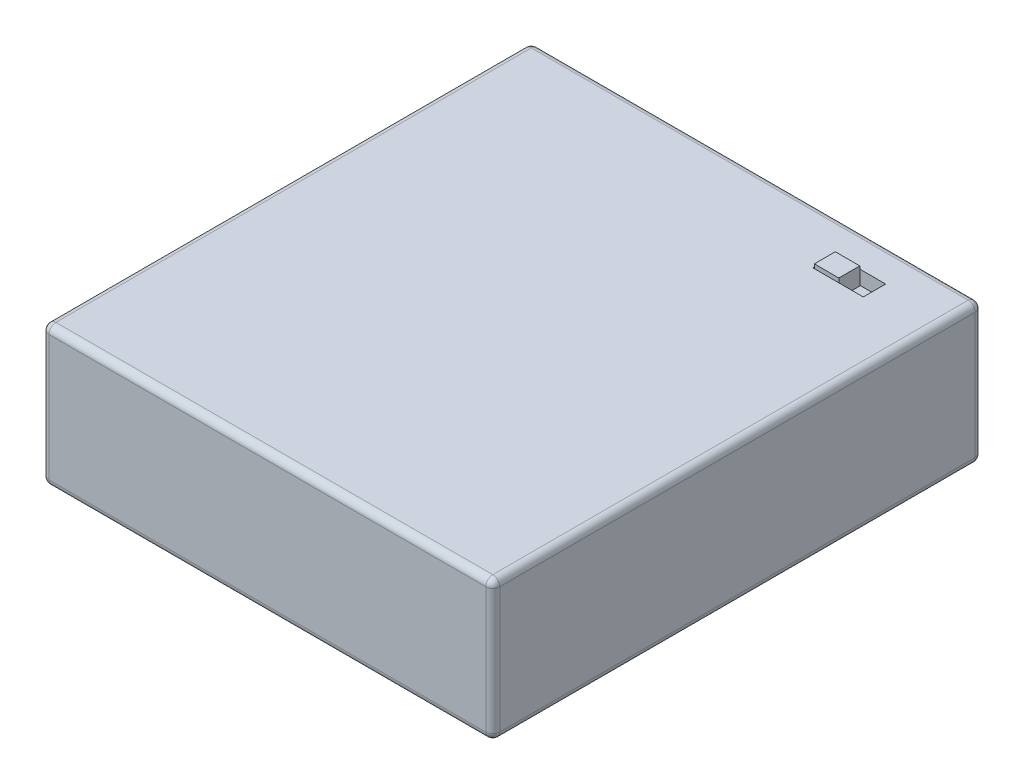
ISO-10303-21;
HEADER;
FILE_DESCRIPTION(('STEP AP214'),'2;1');
FILE_NAME('part.step','',(''),(''),'','','');
FILE_SCHEMA(('AUTOMOTIVE_DESIGN { 1 0 10303 214 1 1 1 1 }'));
ENDSEC;
DATA;
#1=APPLICATION_CONTEXT('core data for automotive mechanical design processes');
#2=APPLICATION_PROTOCOL_DEFINITION('international standard','automotive_design',2000,#1);
#3=PRODUCT_CONTEXT('',#1,'mechanical');
#4=PRODUCT('Part','Part','',(#3));
#5=PRODUCT_RELATED_PRODUCT_CATEGORY('part','',(#4));
#6=PRODUCT_DEFINITION_FORMATION('','',#4);
#7=PRODUCT_DEFINITION_CONTEXT('part definition',#1,'design');
#8=PRODUCT_DEFINITION('design','',#6,#7);
#9=PRODUCT_DEFINITION_SHAPE('','',#8);
#10=(LENGTH_UNIT() NAMED_UNIT(*) SI_UNIT(.MILLI.,.METRE.));
#11=(NAMED_UNIT(*) PLANE_ANGLE_UNIT() SI_UNIT($,.RADIAN.));
#12=(NAMED_UNIT(*) SI_UNIT($,.STERADIAN.) SOLID_ANGLE_UNIT());
#13=UNCERTAINTY_MEASURE_WITH_UNIT(LENGTH_MEASURE(1.E-05),#10,'distance_accuracy_value','');
#14=(GEOMETRIC_REPRESENTATION_CONTEXT(3) GLOBAL_UNCERTAINTY_ASSIGNED_CONTEXT((#13)) GLOBAL_UNIT_ASSIGNED_CONTEXT((#10,
#11,#12)) REPRESENTATION_CONTEXT('',''));
#15=CARTESIAN_POINT('',(0.,0.,0.));
#16=DIRECTION('',(0.,0.,1.));
#17=DIRECTION('',(1.,0.,0.));
#18=AXIS2_PLACEMENT_3D('',#15,#16,#17);
#19=CARTESIAN_POINT('',(-32.25,20.,35.));
#20=DIRECTION('',(0.,0.,-1.));
#21=DIRECTION('',(-1.,0.,0.));
#22=AXIS2_PLACEMENT_3D('',#19,#20,#21);
#23=PLANE('',#22);
#24=DIRECTION('',(0.,-1.,0.));
#25=VECTOR('',#24,1.);
#26=CARTESIAN_POINT('',(31.25,20.,35.));
#27=LINE('',#26,#25);
#28=CARTESIAN_POINT('',(31.25,1.,35.));
#29=VERTEX_POINT('',#28);
#30=CARTESIAN_POINT('',(31.25,19.,35.));
#31=VERTEX_POINT('',#30);
#32=EDGE_CURVE('E266',#29,#31,#27,.F.);
#33=ORIENTED_EDGE('',*,*,#32,.T.);
#34=DIRECTION('',(1.,0.,0.));
#35=VECTOR('',#34,1.);
#36=CARTESIAN_POINT('',(-32.25,19.,35.));
#37=LINE('',#36,#35);
#38=CARTESIAN_POINT('',(-31.25,19.,35.));
#39=VERTEX_POINT('',#38);
#40=EDGE_CURVE('E269',#31,#39,#37,.F.);
#41=ORIENTED_EDGE('',*,*,#40,.T.);
#42=DIRECTION('',(0.,-1.,0.));
#43=VECTOR('',#42,1.);
#44=CARTESIAN_POINT('',(-31.25,0.,35.));
#45=LINE('',#44,#43);
#46=CARTESIAN_POINT('',(-31.25,1.,35.));
#47=VERTEX_POINT('',#46);
#48=EDGE_CURVE('E264',#39,#47,#45,.T.);
#49=ORIENTED_EDGE('',*,*,#48,.T.);
#50=DIRECTION('',(1.,0.,0.));
#51=VECTOR('',#50,1.);
#52=CARTESIAN_POINT('',(-32.25,1.,35.));
#53=LINE('',#52,#51);
#54=EDGE_CURVE('E262',#47,#29,#53,.T.);
#55=ORIENTED_EDGE('',*,*,#54,.T.);
#56=EDGE_LOOP('',(#33,#41,#49,#55));
#57=FACE_BOUND('',#56,.T.);
#58=ADVANCED_FACE('F35',(#57),#23,.F.);
#59=CARTESIAN_POINT('',(32.25,20.,35.));
#60=DIRECTION('',(-1.,0.,0.));
#61=DIRECTION('',(0.,0.,1.));
#62=AXIS2_PLACEMENT_3D('',#59,#60,#61);
#63=PLANE('',#62);
#64=DIRECTION('',(0.,-1.,0.));
#65=VECTOR('',#64,1.);
#66=CARTESIAN_POINT('',(32.25,20.,34.));
#67=LINE('',#66,#65);
#68=CARTESIAN_POINT('',(32.25,19.,34.));
#69=VERTEX_POINT('',#68);
#70=CARTESIAN_POINT('',(32.25,1.,34.));
#71=VERTEX_POINT('',#70);
#72=EDGE_CURVE('E255',#69,#71,#67,.T.);
#73=ORIENTED_EDGE('',*,*,#72,.T.);
#74=DIRECTION('',(0.,0.,-1.));
#75=VECTOR('',#74,1.);
#76=CARTESIAN_POINT('',(32.25,1.,35.));
#77=LINE('',#76,#75);
#78=CARTESIAN_POINT('',(32.25,1.,-34.));
#79=VERTEX_POINT('',#78);
#80=EDGE_CURVE('E260',#71,#79,#77,.T.);
#81=ORIENTED_EDGE('',*,*,#80,.T.);
#82=DIRECTION('',(0.,-1.,0.));
#83=VECTOR('',#82,1.);
#84=CARTESIAN_POINT('',(32.25,20.,-34.));
#85=LINE('',#84,#83);
#86=CARTESIAN_POINT('',(32.25,19.,-34.));
#87=VERTEX_POINT('',#86);
#88=EDGE_CURVE('E257',#79,#87,#85,.F.);
#89=ORIENTED_EDGE('',*,*,#88,.T.);
#90=DIRECTION('',(0.,0.,-1.));
#91=VECTOR('',#90,1.);
#92=CARTESIAN_POINT('',(32.25,19.,35.));
#93=LINE('',#92,#91);
#94=EDGE_CURVE('E253',#87,#69,#93,.F.);
#95=ORIENTED_EDGE('',*,*,#94,.T.);
#96=EDGE_LOOP('',(#73,#81,#89,#95));
#97=FACE_BOUND('',#96,.T.);
#98=ADVANCED_FACE('F440',(#97),#63,.F.);
#99=CARTESIAN_POINT('',(-32.25,20.,-35.));
#100=DIRECTION('',(0.,0.,-1.));
#101=DIRECTION('',(-1.,0.,0.));
#102=AXIS2_PLACEMENT_3D('',#99,#100,#101);
#103=PLANE('',#102);
#104=CARTESIAN_POINT('',(-25.25,15.,-35.));
#105=DIRECTION('',(0.,0.,-1.));
#106=DIRECTION('',(-1.,0.,0.));
#107=AXIS2_PLACEMENT_3D('',#104,#105,#106);
#108=CIRCLE('',#107,2.5);
#109=CARTESIAN_POINT('',(-27.75,15.,-35.));
#110=VERTEX_POINT('',#109);
#111=EDGE_CURVE('E201',#110,#110,#108,.T.);
#112=ORIENTED_EDGE('',*,*,#111,.F.);
#113=EDGE_LOOP('',(#112));
#114=FACE_BOUND('',#113,.T.);
#115=DIRECTION('',(0.,-1.,0.));
#116=VECTOR('',#115,1.);
#117=CARTESIAN_POINT('',(31.25,0.,-35.));
#118=LINE('',#117,#116);
#119=CARTESIAN_POINT('',(31.25,19.,-35.));
#120=VERTEX_POINT('',#119);
#121=CARTESIAN_POINT('',(31.25,1.,-35.));
#122=VERTEX_POINT('',#121);
#123=EDGE_CURVE('E248',#120,#122,#118,.T.);
#124=ORIENTED_EDGE('',*,*,#123,.T.);
#125=DIRECTION('',(1.,0.,0.));
#126=VECTOR('',#125,1.);
#127=CARTESIAN_POINT('',(-32.25,1.,-35.));
#128=LINE('',#127,#126);
#129=CARTESIAN_POINT('',(-31.25,1.,-35.));
#130=VERTEX_POINT('',#129);
#131=EDGE_CURVE('E251',#122,#130,#128,.F.);
#132=ORIENTED_EDGE('',*,*,#131,.T.);
#133=DIRECTION('',(0.,-1.,0.));
#134=VECTOR('',#133,1.);
#135=CARTESIAN_POINT('',(-31.25,20.,-35.));
#136=LINE('',#135,#134);
#137=CARTESIAN_POINT('',(-31.25,19.,-35.));
#138=VERTEX_POINT('',#137);
#139=EDGE_CURVE('E246',#130,#138,#136,.F.);
#140=ORIENTED_EDGE('',*,*,#139,.T.);
#141=DIRECTION('',(1.,0.,0.));
#142=VECTOR('',#141,1.);
#143=CARTESIAN_POINT('',(-32.25,19.,-35.));
#144=LINE('',#143,#142);
#145=EDGE_CURVE('E244',#138,#120,#144,.T.);
#146=ORIENTED_EDGE('',*,*,#145,.T.);
#147=EDGE_LOOP('',(#124,#132,#140,#146));
#148=FACE_BOUND('',#147,.T.);
#149=ADVANCED_FACE('F445',(#114,#148),#103,.T.);
#150=CARTESIAN_POINT('',(-32.25,20.,35.));
#151=DIRECTION('',(-1.,0.,0.));
#152=DIRECTION('',(0.,0.,1.));
#153=AXIS2_PLACEMENT_3D('',#150,#151,#152);
#154=PLANE('',#153);
#155=DIRECTION('',(0.,-1.,0.));
#156=VECTOR('',#155,1.);
#157=CARTESIAN_POINT('',(-32.25,20.,-34.));
#158=LINE('',#157,#156);
#159=CARTESIAN_POINT('',(-32.25,19.,-34.));
#160=VERTEX_POINT('',#159);
#161=CARTESIAN_POINT('',(-32.25,1.,-34.));
#162=VERTEX_POINT('',#161);
#163=EDGE_CURVE('E275',#160,#162,#158,.T.);
#164=ORIENTED_EDGE('',*,*,#163,.T.);
#165=DIRECTION('',(0.,0.,-1.));
#166=VECTOR('',#165,1.);
#167=CARTESIAN_POINT('',(-32.25,1.,35.));
#168=LINE('',#167,#166);
#169=CARTESIAN_POINT('',(-32.25,1.,34.));
#170=VERTEX_POINT('',#169);
#171=EDGE_CURVE('E278',#162,#170,#168,.F.);
#172=ORIENTED_EDGE('',*,*,#171,.T.);
#173=DIRECTION('',(0.,-1.,0.));
#174=VECTOR('',#173,1.);
#175=CARTESIAN_POINT('',(-32.25,20.,34.));
#176=LINE('',#175,#174);
#177=CARTESIAN_POINT('',(-32.25,19.,34.));
#178=VERTEX_POINT('',#177);
#179=EDGE_CURVE('E273',#170,#178,#176,.F.);
#180=ORIENTED_EDGE('',*,*,#179,.T.);
#181=DIRECTION('',(0.,0.,-1.));
#182=VECTOR('',#181,1.);
#183=CARTESIAN_POINT('',(-32.25,19.,35.));
#184=LINE('',#183,#182);
#185=EDGE_CURVE('E271',#178,#160,#184,.T.);
#186=ORIENTED_EDGE('',*,*,#185,.T.);
#187=EDGE_LOOP('',(#164,#172,#180,#186));
#188=FACE_BOUND('',#187,.T.);
#189=ADVANCED_FACE('F385',(#188),#154,.T.);
#190=CARTESIAN_POINT('',(0.,20.,0.));
#191=DIRECTION('',(0.,1.,0.));
#192=DIRECTION('',(0.,0.,1.));
#193=AXIS2_PLACEMENT_3D('',#190,#191,#192);
#194=PLANE('',#193);
#195=DIRECTION('',(0.,0.,-1.));
#196=VECTOR('',#195,1.);
#197=CARTESIAN_POINT('',(23.35,20.,0.));
#198=LINE('',#197,#196);
#199=CARTESIAN_POINT('',(23.35,20.,-26.9));
#200=VERTEX_POINT('',#199);
#201=CARTESIAN_POINT('',(23.35,20.,-30.1));
#202=VERTEX_POINT('',#201);
#203=EDGE_CURVE('E60',#200,#202,#198,.T.);
#204=ORIENTED_EDGE('',*,*,#203,.F.);
#205=DIRECTION('',(-1.,0.,0.));
#206=VECTOR('',#205,1.);
#207=CARTESIAN_POINT('',(0.,20.,-26.9));
#208=LINE('',#207,#206);
#209=CARTESIAN_POINT('',(16.15,20.,-26.9));
#210=VERTEX_POINT('',#209);
#211=EDGE_CURVE('E219',#200,#210,#208,.T.);
#212=ORIENTED_EDGE('',*,*,#211,.T.);
#213=DIRECTION('',(0.,0.,-1.));
#214=VECTOR('',#213,1.);
#215=CARTESIAN_POINT('',(16.15,20.,0.));
#216=LINE('',#215,#214);
#217=CARTESIAN_POINT('',(16.15,20.,-30.1));
#218=VERTEX_POINT('',#217);
#219=EDGE_CURVE('E231',#210,#218,#216,.T.);
#220=ORIENTED_EDGE('',*,*,#219,.T.);
#221=DIRECTION('',(-1.,0.,0.));
#222=VECTOR('',#221,1.);
#223=CARTESIAN_POINT('',(0.,20.,-30.1));
#224=LINE('',#223,#222);
#225=EDGE_CURVE('E228',#202,#218,#224,.T.);
#226=ORIENTED_EDGE('',*,*,#225,.F.);
#227=EDGE_LOOP('',(#204,#212,#220,#226));
#228=FACE_BOUND('',#227,.T.);
#229=DIRECTION('',(1.,0.,0.));
#230=VECTOR('',#229,1.);
#231=CARTESIAN_POINT('',(32.25,20.,34.));
#232=LINE('',#231,#230);
#233=CARTESIAN_POINT('',(-31.25,20.,34.));
#234=VERTEX_POINT('',#233);
#235=CARTESIAN_POINT('',(31.25,20.,34.));
#236=VERTEX_POINT('',#235);
#237=EDGE_CURVE('E291',#234,#236,#232,.T.);
#238=ORIENTED_EDGE('',*,*,#237,.T.);
#239=DIRECTION('',(0.,0.,-1.));
#240=VECTOR('',#239,1.);
#241=CARTESIAN_POINT('',(31.25,20.,-35.));
#242=LINE('',#241,#240);
#243=CARTESIAN_POINT('',(31.25,20.,-34.));
#244=VERTEX_POINT('',#243);
#245=EDGE_CURVE('E11',#236,#244,#242,.T.);
#246=ORIENTED_EDGE('',*,*,#245,.T.);
#247=DIRECTION('',(1.,0.,0.));
#248=VECTOR('',#247,1.);
#249=CARTESIAN_POINT('',(0.,20.,-34.));
#250=LINE('',#249,#248);
#251=CARTESIAN_POINT('',(-31.25,20.,-34.));
#252=VERTEX_POINT('',#251);
#253=EDGE_CURVE('E44',#244,#252,#250,.F.);
#254=ORIENTED_EDGE('',*,*,#253,.T.);
#255=DIRECTION('',(0.,0.,-1.));
#256=VECTOR('',#255,1.);
#257=CARTESIAN_POINT('',(-31.25,20.,0.));
#258=LINE('',#257,#256);
#259=EDGE_CURVE('E289',#252,#234,#258,.F.);
#260=ORIENTED_EDGE('',*,*,#259,.T.);
#261=EDGE_LOOP('',(#238,#246,#254,#260));
#262=FACE_BOUND('',#261,.T.);
#263=ADVANCED_FACE('F376',(#228,#262),#194,.T.);
#264=CARTESIAN_POINT('',(0.,0.,0.));
#265=DIRECTION('',(0.,1.,0.));
#266=DIRECTION('',(0.,0.,1.));
#267=AXIS2_PLACEMENT_3D('',#264,#265,#266);
#268=PLANE('',#267);
#269=DIRECTION('',(1.,0.,0.));
#270=VECTOR('',#269,1.);
#271=CARTESIAN_POINT('',(32.25,0.,-34.));
#272=LINE('',#271,#270);
#273=CARTESIAN_POINT('',(-31.25,0.,-34.));
#274=VERTEX_POINT('',#273);
#275=CARTESIAN_POINT('',(31.25,0.,-34.));
#276=VERTEX_POINT('',#275);
#277=EDGE_CURVE('E284',#274,#276,#272,.T.);
#278=ORIENTED_EDGE('',*,*,#277,.T.);
#279=DIRECTION('',(0.,0.,-1.));
#280=VECTOR('',#279,1.);
#281=CARTESIAN_POINT('',(31.25,0.,0.));
#282=LINE('',#281,#280);
#283=CARTESIAN_POINT('',(31.25,0.,34.));
#284=VERTEX_POINT('',#283);
#285=EDGE_CURVE('E287',#276,#284,#282,.F.);
#286=ORIENTED_EDGE('',*,*,#285,.T.);
#287=DIRECTION('',(1.,0.,0.));
#288=VECTOR('',#287,1.);
#289=CARTESIAN_POINT('',(0.,0.,34.));
#290=LINE('',#289,#288);
#291=CARTESIAN_POINT('',(-31.25,0.,34.));
#292=VERTEX_POINT('',#291);
#293=EDGE_CURVE('E282',#284,#292,#290,.F.);
#294=ORIENTED_EDGE('',*,*,#293,.T.);
#295=DIRECTION('',(0.,0.,-1.));
#296=VECTOR('',#295,1.);
#297=CARTESIAN_POINT('',(-31.25,0.,-35.));
#298=LINE('',#297,#296);
#299=EDGE_CURVE('E280',#292,#274,#298,.T.);
#300=ORIENTED_EDGE('',*,*,#299,.T.);
#301=EDGE_LOOP('',(#278,#286,#294,#300));
#302=FACE_BOUND('',#301,.T.);
#303=ADVANCED_FACE('F494',(#302),#268,.F.);
#304=CARTESIAN_POINT('',(-31.25,20.,34.));
#305=DIRECTION('',(0.,1.,0.));
#306=DIRECTION('',(0.,0.,1.));
#307=AXIS2_PLACEMENT_3D('',#304,#305,#306);
#308=CYLINDRICAL_SURFACE('',#307,1.);
#309=CARTESIAN_POINT('',(-31.25,19.,34.));
#310=DIRECTION('',(0.,1.,0.));
#311=DIRECTION('',(0.,0.,1.));
#312=AXIS2_PLACEMENT_3D('',#309,#310,#311);
#313=CIRCLE('',#312,1.);
#314=EDGE_CURVE('E39',#178,#39,#313,.T.);
#315=ORIENTED_EDGE('',*,*,#314,.F.);
#316=ORIENTED_EDGE('',*,*,#179,.F.);
#317=CARTESIAN_POINT('',(-31.25,1.,34.));
#318=DIRECTION('',(0.,-1.,0.));
#319=DIRECTION('',(1.,0.,0.));
#320=AXIS2_PLACEMENT_3D('',#317,#318,#319);
#321=CIRCLE('',#320,1.);
#322=EDGE_CURVE('E353',#47,#170,#321,.T.);
#323=ORIENTED_EDGE('',*,*,#322,.F.);
#324=ORIENTED_EDGE('',*,*,#48,.F.);
#325=EDGE_LOOP('',(#315,#316,#323,#324));
#326=FACE_BOUND('',#325,.T.);
#327=ADVANCED_FACE('F37',(#326),#308,.T.);
#328=CARTESIAN_POINT('',(-31.25,19.,34.));
#329=DIRECTION('',(0.,0.,1.));
#330=DIRECTION('',(1.,0.,0.));
#331=AXIS2_PLACEMENT_3D('',#328,#329,#330);
#332=SPHERICAL_SURFACE('',#331,1.);
#333=CARTESIAN_POINT('',(-31.25,19.,34.));
#334=DIRECTION('',(0.,0.,1.));
#335=DIRECTION('',(1.,0.,0.));
#336=AXIS2_PLACEMENT_3D('',#333,#334,#335);
#337=CIRCLE('',#336,1.);
#338=EDGE_CURVE('E348',#178,#234,#337,.F.);
#339=ORIENTED_EDGE('',*,*,#338,.F.);
#340=ORIENTED_EDGE('',*,*,#314,.T.);
#341=CARTESIAN_POINT('',(-31.25,19.,34.));
#342=DIRECTION('',(-1.,0.,0.));
#343=DIRECTION('',(0.,0.,1.));
#344=AXIS2_PLACEMENT_3D('',#341,#342,#343);
#345=CIRCLE('',#344,1.);
#346=EDGE_CURVE('E351',#234,#39,#345,.F.);
#347=ORIENTED_EDGE('',*,*,#346,.F.);
#348=EDGE_LOOP('',(#339,#340,#347));
#349=FACE_BOUND('',#348,.T.);
#350=ADVANCED_FACE('F364',(#349),#332,.T.);
#351=CARTESIAN_POINT('',(-31.25,1.,34.));
#352=DIRECTION('',(-1.,0.,0.));
#353=DIRECTION('',(0.,0.,1.));
#354=AXIS2_PLACEMENT_3D('',#351,#352,#353);
#355=SPHERICAL_SURFACE('',#354,1.);
#356=CARTESIAN_POINT('',(-31.25,1.,34.));
#357=DIRECTION('',(-1.,0.,0.));
#358=DIRECTION('',(0.,0.,1.));
#359=AXIS2_PLACEMENT_3D('',#356,#357,#358);
#360=CIRCLE('',#359,1.);
#361=EDGE_CURVE('E342',#47,#292,#360,.F.);
#362=ORIENTED_EDGE('',*,*,#361,.F.);
#363=ORIENTED_EDGE('',*,*,#322,.T.);
#364=CARTESIAN_POINT('',(-31.25,1.,34.));
#365=DIRECTION('',(0.,0.,1.));
#366=DIRECTION('',(1.,0.,0.));
#367=AXIS2_PLACEMENT_3D('',#364,#365,#366);
#368=CIRCLE('',#367,1.);
#369=EDGE_CURVE('E345',#292,#170,#368,.F.);
#370=ORIENTED_EDGE('',*,*,#369,.F.);
#371=EDGE_LOOP('',(#362,#363,#370));
#372=FACE_BOUND('',#371,.T.);
#373=ADVANCED_FACE('F400',(#372),#355,.T.);
#374=CARTESIAN_POINT('',(0.,19.,34.));
#375=DIRECTION('',(-1.,0.,0.));
#376=DIRECTION('',(0.,0.,1.));
#377=AXIS2_PLACEMENT_3D('',#374,#375,#376);
#378=CYLINDRICAL_SURFACE('',#377,1.);
#379=ORIENTED_EDGE('',*,*,#346,.T.);
#380=ORIENTED_EDGE('',*,*,#40,.F.);
#381=CARTESIAN_POINT('',(31.25,19.,34.));
#382=DIRECTION('',(1.,0.,0.));
#383=DIRECTION('',(0.,0.,-1.));
#384=AXIS2_PLACEMENT_3D('',#381,#382,#383);
#385=CIRCLE('',#384,1.);
#386=EDGE_CURVE('E337',#236,#31,#385,.T.);
#387=ORIENTED_EDGE('',*,*,#386,.F.);
#388=ORIENTED_EDGE('',*,*,#237,.F.);
#389=EDGE_LOOP('',(#379,#380,#387,#388));
#390=FACE_BOUND('',#389,.T.);
#391=ADVANCED_FACE('F372',(#390),#378,.T.);
#392=CARTESIAN_POINT('',(-31.25,19.,35.));
#393=DIRECTION('',(0.,0.,-1.));
#394=DIRECTION('',(-1.,0.,0.));
#395=AXIS2_PLACEMENT_3D('',#392,#393,#394);
#396=CYLINDRICAL_SURFACE('',#395,1.);
#397=ORIENTED_EDGE('',*,*,#338,.T.);
#398=ORIENTED_EDGE('',*,*,#259,.F.);
#399=CARTESIAN_POINT('',(-31.25,19.,-34.));
#400=DIRECTION('',(0.,0.,-1.));
#401=DIRECTION('',(-1.,0.,0.));
#402=AXIS2_PLACEMENT_3D('',#399,#400,#401);
#403=CIRCLE('',#402,1.);
#404=EDGE_CURVE('E334',#160,#252,#403,.T.);
#405=ORIENTED_EDGE('',*,*,#404,.F.);
#406=ORIENTED_EDGE('',*,*,#185,.F.);
#407=EDGE_LOOP('',(#397,#398,#405,#406));
#408=FACE_BOUND('',#407,.T.);
#409=ADVANCED_FACE('F382',(#408),#396,.T.);
#410=CARTESIAN_POINT('',(-31.25,20.,-34.));
#411=DIRECTION('',(0.,-1.,0.));
#412=DIRECTION('',(0.,0.,-1.));
#413=AXIS2_PLACEMENT_3D('',#410,#411,#412);
#414=CYLINDRICAL_SURFACE('',#413,1.);
#415=CARTESIAN_POINT('',(-31.25,1.,-34.));
#416=DIRECTION('',(0.,-1.,0.));
#417=DIRECTION('',(0.,0.,-1.));
#418=AXIS2_PLACEMENT_3D('',#415,#416,#417);
#419=CIRCLE('',#418,1.);
#420=EDGE_CURVE('E328',#162,#130,#419,.T.);
#421=ORIENTED_EDGE('',*,*,#420,.F.);
#422=ORIENTED_EDGE('',*,*,#163,.F.);
#423=CARTESIAN_POINT('',(-31.25,19.,-34.));
#424=DIRECTION('',(0.,1.,0.));
#425=DIRECTION('',(0.,0.,1.));
#426=AXIS2_PLACEMENT_3D('',#423,#424,#425);
#427=CIRCLE('',#426,1.);
#428=EDGE_CURVE('E331',#138,#160,#427,.T.);
#429=ORIENTED_EDGE('',*,*,#428,.F.);
#430=ORIENTED_EDGE('',*,*,#139,.F.);
#431=EDGE_LOOP('',(#421,#422,#429,#430));
#432=FACE_BOUND('',#431,.T.);
#433=ADVANCED_FACE('F389',(#432),#414,.T.);
#434=CARTESIAN_POINT('',(-31.25,1.,0.));
#435=DIRECTION('',(0.,0.,1.));
#436=DIRECTION('',(1.,0.,0.));
#437=AXIS2_PLACEMENT_3D('',#434,#435,#436);
#438=CYLINDRICAL_SURFACE('',#437,1.);
#439=ORIENTED_EDGE('',*,*,#369,.T.);
#440=ORIENTED_EDGE('',*,*,#171,.F.);
#441=CARTESIAN_POINT('',(-31.25,1.,-34.));
#442=DIRECTION('',(0.,0.,-1.));
#443=DIRECTION('',(-1.,0.,0.));
#444=AXIS2_PLACEMENT_3D('',#441,#442,#443);
#445=CIRCLE('',#444,1.);
#446=EDGE_CURVE('E326',#274,#162,#445,.T.);
#447=ORIENTED_EDGE('',*,*,#446,.F.);
#448=ORIENTED_EDGE('',*,*,#299,.F.);
#449=EDGE_LOOP('',(#439,#440,#447,#448));
#450=FACE_BOUND('',#449,.T.);
#451=ADVANCED_FACE('F397',(#450),#438,.T.);
#452=CARTESIAN_POINT('',(-32.25,1.,34.));
#453=DIRECTION('',(1.,0.,0.));
#454=DIRECTION('',(0.,0.,-1.));
#455=AXIS2_PLACEMENT_3D('',#452,#453,#454);
#456=CYLINDRICAL_SURFACE('',#455,1.);
#457=ORIENTED_EDGE('',*,*,#361,.T.);
#458=ORIENTED_EDGE('',*,*,#293,.F.);
#459=CARTESIAN_POINT('',(31.25,1.,34.));
#460=DIRECTION('',(1.,0.,0.));
#461=DIRECTION('',(0.,0.,-1.));
#462=AXIS2_PLACEMENT_3D('',#459,#460,#461);
#463=CIRCLE('',#462,1.);
#464=EDGE_CURVE('E323',#29,#284,#463,.T.);
#465=ORIENTED_EDGE('',*,*,#464,.F.);
#466=ORIENTED_EDGE('',*,*,#54,.F.);
#467=EDGE_LOOP('',(#457,#458,#465,#466));
#468=FACE_BOUND('',#467,.T.);
#469=ADVANCED_FACE('F404',(#468),#456,.T.);
#470=CARTESIAN_POINT('',(31.25,20.,34.));
#471=DIRECTION('',(0.,-1.,0.));
#472=DIRECTION('',(0.,0.,-1.));
#473=AXIS2_PLACEMENT_3D('',#470,#471,#472);
#474=CYLINDRICAL_SURFACE('',#473,1.);
#475=CARTESIAN_POINT('',(31.25,19.,34.));
#476=DIRECTION('',(0.,1.,0.));
#477=DIRECTION('',(0.,0.,1.));
#478=AXIS2_PLACEMENT_3D('',#475,#476,#477);
#479=CIRCLE('',#478,1.);
#480=EDGE_CURVE('E339',#31,#69,#479,.T.);
#481=ORIENTED_EDGE('',*,*,#480,.F.);
#482=ORIENTED_EDGE('',*,*,#32,.F.);
#483=CARTESIAN_POINT('',(31.25,1.,34.));
#484=DIRECTION('',(0.,-1.,0.));
#485=DIRECTION('',(0.,0.,-1.));
#486=AXIS2_PLACEMENT_3D('',#483,#484,#485);
#487=CIRCLE('',#486,1.);
#488=EDGE_CURVE('E320',#71,#29,#487,.T.);
#489=ORIENTED_EDGE('',*,*,#488,.F.);
#490=ORIENTED_EDGE('',*,*,#72,.F.);
#491=EDGE_LOOP('',(#481,#482,#489,#490));
#492=FACE_BOUND('',#491,.T.);
#493=ADVANCED_FACE('F410',(#492),#474,.T.);
#494=CARTESIAN_POINT('',(31.25,19.,34.));
#495=DIRECTION('',(0.,0.,1.));
#496=DIRECTION('',(1.,0.,0.));
#497=AXIS2_PLACEMENT_3D('',#494,#495,#496);
#498=SPHERICAL_SURFACE('',#497,1.);
#499=ORIENTED_EDGE('',*,*,#386,.T.);
#500=ORIENTED_EDGE('',*,*,#480,.T.);
#501=CARTESIAN_POINT('',(31.25,19.,34.));
#502=DIRECTION('',(0.,0.,1.));
#503=DIRECTION('',(1.,0.,0.));
#504=AXIS2_PLACEMENT_3D('',#501,#502,#503);
#505=CIRCLE('',#504,1.);
#506=EDGE_CURVE('E317',#236,#69,#505,.F.);
#507=ORIENTED_EDGE('',*,*,#506,.F.);
#508=EDGE_LOOP('',(#499,#500,#507));
#509=FACE_BOUND('',#508,.T.);
#510=ADVANCED_FACE('F414',(#509),#498,.T.);
#511=CARTESIAN_POINT('',(-31.25,19.,-34.));
#512=DIRECTION('',(-1.,0.,0.));
#513=DIRECTION('',(0.,0.,1.));
#514=AXIS2_PLACEMENT_3D('',#511,#512,#513);
#515=SPHERICAL_SURFACE('',#514,1.);
#516=ORIENTED_EDGE('',*,*,#428,.T.);
#517=ORIENTED_EDGE('',*,*,#404,.T.);
#518=CARTESIAN_POINT('',(-31.25,19.,-34.));
#519=DIRECTION('',(-1.,0.,0.));
#520=DIRECTION('',(0.,0.,1.));
#521=AXIS2_PLACEMENT_3D('',#518,#519,#520);
#522=CIRCLE('',#521,1.);
#523=EDGE_CURVE('E315',#138,#252,#522,.F.);
#524=ORIENTED_EDGE('',*,*,#523,.F.);
#525=EDGE_LOOP('',(#516,#517,#524));
#526=FACE_BOUND('',#525,.T.);
#527=ADVANCED_FACE('F428',(#526),#515,.T.);
#528=CARTESIAN_POINT('',(-31.25,1.,-34.));
#529=DIRECTION('',(-1.,0.,0.));
#530=DIRECTION('',(0.,0.,1.));
#531=AXIS2_PLACEMENT_3D('',#528,#529,#530);
#532=SPHERICAL_SURFACE('',#531,1.);
#533=ORIENTED_EDGE('',*,*,#446,.T.);
#534=ORIENTED_EDGE('',*,*,#420,.T.);
#535=CARTESIAN_POINT('',(-31.25,1.,-34.));
#536=DIRECTION('',(-1.,0.,0.));
#537=DIRECTION('',(0.,0.,1.));
#538=AXIS2_PLACEMENT_3D('',#535,#536,#537);
#539=CIRCLE('',#538,1.);
#540=EDGE_CURVE('E312',#274,#130,#539,.F.);
#541=ORIENTED_EDGE('',*,*,#540,.F.);
#542=EDGE_LOOP('',(#533,#534,#541));
#543=FACE_BOUND('',#542,.T.);
#544=ADVANCED_FACE('F430',(#543),#532,.T.);
#545=CARTESIAN_POINT('',(31.25,1.,34.));
#546=DIRECTION('',(0.,0.,1.));
#547=DIRECTION('',(0.,-1.,0.));
#548=AXIS2_PLACEMENT_3D('',#545,#546,#547);
#549=SPHERICAL_SURFACE('',#548,1.);
#550=ORIENTED_EDGE('',*,*,#488,.T.);
#551=ORIENTED_EDGE('',*,*,#464,.T.);
#552=CARTESIAN_POINT('',(31.25,1.,34.));
#553=DIRECTION('',(0.,0.,1.));
#554=DIRECTION('',(1.,0.,0.));
#555=AXIS2_PLACEMENT_3D('',#552,#553,#554);
#556=CIRCLE('',#555,1.);
#557=EDGE_CURVE('E309',#71,#284,#556,.F.);
#558=ORIENTED_EDGE('',*,*,#557,.F.);
#559=EDGE_LOOP('',(#550,#551,#558));
#560=FACE_BOUND('',#559,.T.);
#561=ADVANCED_FACE('F436',(#560),#549,.T.);
#562=CARTESIAN_POINT('',(31.25,19.,0.));
#563=DIRECTION('',(0.,0.,1.));
#564=DIRECTION('',(1.,0.,0.));
#565=AXIS2_PLACEMENT_3D('',#562,#563,#564);
#566=CYLINDRICAL_SURFACE('',#565,1.);
#567=ORIENTED_EDGE('',*,*,#506,.T.);
#568=ORIENTED_EDGE('',*,*,#94,.F.);
#569=CARTESIAN_POINT('',(31.25,19.,-34.));
#570=DIRECTION('',(0.,0.,-1.));
#571=DIRECTION('',(-1.,0.,0.));
#572=AXIS2_PLACEMENT_3D('',#569,#570,#571);
#573=CIRCLE('',#572,1.);
#574=EDGE_CURVE('E306',#244,#87,#573,.T.);
#575=ORIENTED_EDGE('',*,*,#574,.F.);
#576=ORIENTED_EDGE('',*,*,#245,.F.);
#577=EDGE_LOOP('',(#567,#568,#575,#576));
#578=FACE_BOUND('',#577,.T.);
#579=ADVANCED_FACE('F417',(#578),#566,.T.);
#580=CARTESIAN_POINT('',(-32.25,19.,-34.));
#581=DIRECTION('',(1.,0.,0.));
#582=DIRECTION('',(0.,0.,-1.));
#583=AXIS2_PLACEMENT_3D('',#580,#581,#582);
#584=CYLINDRICAL_SURFACE('',#583,1.);
#585=ORIENTED_EDGE('',*,*,#523,.T.);
#586=ORIENTED_EDGE('',*,*,#253,.F.);
#587=CARTESIAN_POINT('',(31.25,19.,-34.));
#588=DIRECTION('',(1.,0.,0.));
#589=DIRECTION('',(0.,0.,-1.));
#590=AXIS2_PLACEMENT_3D('',#587,#588,#589);
#591=CIRCLE('',#590,1.);
#592=EDGE_CURVE('E303',#120,#244,#591,.T.);
#593=ORIENTED_EDGE('',*,*,#592,.F.);
#594=ORIENTED_EDGE('',*,*,#145,.F.);
#595=EDGE_LOOP('',(#585,#586,#593,#594));
#596=FACE_BOUND('',#595,.T.);
#597=ADVANCED_FACE('F426',(#596),#584,.T.);
#598=CARTESIAN_POINT('',(0.,1.,-34.));
#599=DIRECTION('',(-1.,0.,0.));
#600=DIRECTION('',(0.,0.,1.));
#601=AXIS2_PLACEMENT_3D('',#598,#599,#600);
#602=CYLINDRICAL_SURFACE('',#601,1.);
#603=ORIENTED_EDGE('',*,*,#540,.T.);
#604=ORIENTED_EDGE('',*,*,#131,.F.);
#605=CARTESIAN_POINT('',(31.25,1.,-34.));
#606=DIRECTION('',(1.,0.,0.));
#607=DIRECTION('',(0.,0.,-1.));
#608=AXIS2_PLACEMENT_3D('',#605,#606,#607);
#609=CIRCLE('',#608,1.);
#610=EDGE_CURVE('E300',#276,#122,#609,.T.);
#611=ORIENTED_EDGE('',*,*,#610,.F.);
#612=ORIENTED_EDGE('',*,*,#277,.F.);
#613=EDGE_LOOP('',(#603,#604,#611,#612));
#614=FACE_BOUND('',#613,.T.);
#615=ADVANCED_FACE('F464',(#614),#602,.T.);
#616=CARTESIAN_POINT('',(31.25,1.,35.));
#617=DIRECTION('',(0.,0.,-1.));
#618=DIRECTION('',(-1.,0.,0.));
#619=AXIS2_PLACEMENT_3D('',#616,#617,#618);
#620=CYLINDRICAL_SURFACE('',#619,1.);
#621=ORIENTED_EDGE('',*,*,#557,.T.);
#622=ORIENTED_EDGE('',*,*,#285,.F.);
#623=CARTESIAN_POINT('',(31.25,1.,-34.));
#624=DIRECTION('',(0.,0.,-1.));
#625=DIRECTION('',(-1.,0.,0.));
#626=AXIS2_PLACEMENT_3D('',#623,#624,#625);
#627=CIRCLE('',#626,1.);
#628=EDGE_CURVE('E298',#79,#276,#627,.T.);
#629=ORIENTED_EDGE('',*,*,#628,.F.);
#630=ORIENTED_EDGE('',*,*,#80,.F.);
#631=EDGE_LOOP('',(#621,#622,#629,#630));
#632=FACE_BOUND('',#631,.T.);
#633=ADVANCED_FACE('F461',(#632),#620,.T.);
#634=CARTESIAN_POINT('',(31.25,19.,-34.));
#635=DIRECTION('',(0.,1.,0.));
#636=DIRECTION('',(0.,0.,1.));
#637=AXIS2_PLACEMENT_3D('',#634,#635,#636);
#638=SPHERICAL_SURFACE('',#637,1.);
#639=ORIENTED_EDGE('',*,*,#592,.T.);
#640=ORIENTED_EDGE('',*,*,#574,.T.);
#641=CARTESIAN_POINT('',(31.25,19.,-34.));
#642=DIRECTION('',(0.,1.,0.));
#643=DIRECTION('',(0.,0.,1.));
#644=AXIS2_PLACEMENT_3D('',#641,#642,#643);
#645=CIRCLE('',#644,1.);
#646=EDGE_CURVE('E296',#120,#87,#645,.F.);
#647=ORIENTED_EDGE('',*,*,#646,.F.);
#648=EDGE_LOOP('',(#639,#640,#647));
#649=FACE_BOUND('',#648,.T.);
#650=ADVANCED_FACE('F422',(#649),#638,.T.);
#651=CARTESIAN_POINT('',(31.25,1.,-34.));
#652=DIRECTION('',(0.,-1.,0.));
#653=DIRECTION('',(0.,0.,-1.));
#654=AXIS2_PLACEMENT_3D('',#651,#652,#653);
#655=SPHERICAL_SURFACE('',#654,1.);
#656=ORIENTED_EDGE('',*,*,#628,.T.);
#657=ORIENTED_EDGE('',*,*,#610,.T.);
#658=CARTESIAN_POINT('',(31.25,1.,-34.));
#659=DIRECTION('',(0.,-1.,0.));
#660=DIRECTION('',(1.,0.,0.));
#661=AXIS2_PLACEMENT_3D('',#658,#659,#660);
#662=CIRCLE('',#661,1.);
#663=EDGE_CURVE('E238',#79,#122,#662,.F.);
#664=ORIENTED_EDGE('',*,*,#663,.F.);
#665=EDGE_LOOP('',(#656,#657,#664));
#666=FACE_BOUND('',#665,.T.);
#667=ADVANCED_FACE('F454',(#666),#655,.T.);
#668=CARTESIAN_POINT('',(31.25,20.,-34.));
#669=DIRECTION('',(0.,1.,0.));
#670=DIRECTION('',(0.,0.,1.));
#671=AXIS2_PLACEMENT_3D('',#668,#669,#670);
#672=CYLINDRICAL_SURFACE('',#671,1.);
#673=ORIENTED_EDGE('',*,*,#646,.T.);
#674=ORIENTED_EDGE('',*,*,#88,.F.);
#675=ORIENTED_EDGE('',*,*,#663,.T.);
#676=ORIENTED_EDGE('',*,*,#123,.F.);
#677=EDGE_LOOP('',(#673,#674,#675,#676));
#678=FACE_BOUND('',#677,.T.);
#679=ADVANCED_FACE('F450',(#678),#672,.T.);
#680=CARTESIAN_POINT('',(23.35,18.,0.));
#681=DIRECTION('',(1.,0.,0.));
#682=DIRECTION('',(0.,0.,-1.));
#683=AXIS2_PLACEMENT_3D('',#680,#681,#682);
#684=PLANE('',#683);
#685=ORIENTED_EDGE('',*,*,#203,.T.);
#686=DIRECTION('',(0.,1.,0.));
#687=VECTOR('',#686,1.);
#688=CARTESIAN_POINT('',(23.35,18.,-30.1));
#689=LINE('',#688,#687);
#690=CARTESIAN_POINT('',(23.35,18.,-30.1));
#691=VERTEX_POINT('',#690);
#692=EDGE_CURVE('E226',#691,#202,#689,.T.);
#693=ORIENTED_EDGE('',*,*,#692,.F.);
#694=DIRECTION('',(0.,0.,-1.));
#695=VECTOR('',#694,1.);
#696=CARTESIAN_POINT('',(23.35,18.,0.));
#697=LINE('',#696,#695);
#698=CARTESIAN_POINT('',(23.35,18.,-26.9));
#699=VERTEX_POINT('',#698);
#700=EDGE_CURVE('E215',#699,#691,#697,.T.);
#701=ORIENTED_EDGE('',*,*,#700,.F.);
#702=DIRECTION('',(0.,1.,0.));
#703=VECTOR('',#702,1.);
#704=CARTESIAN_POINT('',(23.35,18.,-26.9));
#705=LINE('',#704,#703);
#706=EDGE_CURVE('E236',#699,#200,#705,.T.);
#707=ORIENTED_EDGE('',*,*,#706,.T.);
#708=EDGE_LOOP('',(#685,#693,#701,#707));
#709=FACE_BOUND('',#708,.T.);
#710=ADVANCED_FACE('F453',(#709),#684,.F.);
#711=CARTESIAN_POINT('',(0.,18.,-26.9));
#712=DIRECTION('',(0.,0.,-1.));
#713=DIRECTION('',(-1.,0.,0.));
#714=AXIS2_PLACEMENT_3D('',#711,#712,#713);
#715=PLANE('',#714);
#716=ORIENTED_EDGE('',*,*,#211,.F.);
#717=ORIENTED_EDGE('',*,*,#706,.F.);
#718=DIRECTION('',(-1.,0.,0.));
#719=VECTOR('',#718,1.);
#720=CARTESIAN_POINT('',(0.,18.,-26.9));
#721=LINE('',#720,#719);
#722=CARTESIAN_POINT('',(16.15,18.,-26.9));
#723=VERTEX_POINT('',#722);
#724=EDGE_CURVE('E224',#699,#723,#721,.T.);
#725=ORIENTED_EDGE('',*,*,#724,.T.);
#726=DIRECTION('',(0.,1.,0.));
#727=VECTOR('',#726,1.);
#728=CARTESIAN_POINT('',(16.15,18.,-26.9));
#729=LINE('',#728,#727);
#730=EDGE_CURVE('E239',#723,#210,#729,.T.);
#731=ORIENTED_EDGE('',*,*,#730,.T.);
#732=EDGE_LOOP('',(#716,#717,#725,#731));
#733=FACE_BOUND('',#732,.T.);
#734=ADVANCED_FACE('F503',(#733),#715,.T.);
#735=CARTESIAN_POINT('',(16.15,18.,0.));
#736=DIRECTION('',(1.,0.,0.));
#737=DIRECTION('',(0.,0.,-1.));
#738=AXIS2_PLACEMENT_3D('',#735,#736,#737);
#739=PLANE('',#738);
#740=ORIENTED_EDGE('',*,*,#219,.F.);
#741=ORIENTED_EDGE('',*,*,#730,.F.);
#742=DIRECTION('',(0.,0.,-1.));
#743=VECTOR('',#742,1.);
#744=CARTESIAN_POINT('',(16.15,18.,0.));
#745=LINE('',#744,#743);
#746=CARTESIAN_POINT('',(16.15,18.,-30.1));
#747=VERTEX_POINT('',#746);
#748=EDGE_CURVE('E222',#723,#747,#745,.T.);
#749=ORIENTED_EDGE('',*,*,#748,.T.);
#750=DIRECTION('',(0.,1.,0.));
#751=VECTOR('',#750,1.);
#752=CARTESIAN_POINT('',(16.15,18.,-30.1));
#753=LINE('',#752,#751);
#754=EDGE_CURVE('E241',#747,#218,#753,.T.);
#755=ORIENTED_EDGE('',*,*,#754,.T.);
#756=EDGE_LOOP('',(#740,#741,#749,#755));
#757=FACE_BOUND('',#756,.T.);
#758=ADVANCED_FACE('F508',(#757),#739,.T.);
#759=CARTESIAN_POINT('',(0.,18.,-30.1));
#760=DIRECTION('',(0.,0.,-1.));
#761=DIRECTION('',(-1.,0.,0.));
#762=AXIS2_PLACEMENT_3D('',#759,#760,#761);
#763=PLANE('',#762);
#764=ORIENTED_EDGE('',*,*,#225,.T.);
#765=ORIENTED_EDGE('',*,*,#754,.F.);
#766=DIRECTION('',(-1.,0.,0.));
#767=VECTOR('',#766,1.);
#768=CARTESIAN_POINT('',(0.,18.,-30.1));
#769=LINE('',#768,#767);
#770=EDGE_CURVE('E218',#691,#747,#769,.T.);
#771=ORIENTED_EDGE('',*,*,#770,.F.);
#772=ORIENTED_EDGE('',*,*,#692,.T.);
#773=EDGE_LOOP('',(#764,#765,#771,#772));
#774=FACE_BOUND('',#773,.T.);
#775=ADVANCED_FACE('F504',(#774),#763,.F.);
#776=CARTESIAN_POINT('',(0.,18.,0.));
#777=DIRECTION('',(0.,1.,0.));
#778=DIRECTION('',(0.,0.,1.));
#779=AXIS2_PLACEMENT_3D('',#776,#777,#778);
#780=PLANE('',#779);
#781=DIRECTION('',(0.,0.,-1.));
#782=VECTOR('',#781,1.);
#783=CARTESIAN_POINT('',(16.25,18.,0.));
#784=LINE('',#783,#782);
#785=CARTESIAN_POINT('',(16.25,18.,-27.));
#786=VERTEX_POINT('',#785);
#787=CARTESIAN_POINT('',(16.25,18.,-30.));
#788=VERTEX_POINT('',#787);
#789=EDGE_CURVE('E206',#786,#788,#784,.T.);
#790=ORIENTED_EDGE('',*,*,#789,.T.);
#791=DIRECTION('',(-1.,0.,0.));
#792=VECTOR('',#791,1.);
#793=CARTESIAN_POINT('',(0.,18.,-30.));
#794=LINE('',#793,#792);
#795=CARTESIAN_POINT('',(19.75,18.,-30.));
#796=VERTEX_POINT('',#795);
#797=EDGE_CURVE('E187',#796,#788,#794,.T.);
#798=ORIENTED_EDGE('',*,*,#797,.F.);
#799=DIRECTION('',(0.,0.,-1.));
#800=VECTOR('',#799,1.);
#801=CARTESIAN_POINT('',(19.75,18.,0.));
#802=LINE('',#801,#800);
#803=CARTESIAN_POINT('',(19.75,18.,-27.));
#804=VERTEX_POINT('',#803);
#805=EDGE_CURVE('E198',#804,#796,#802,.T.);
#806=ORIENTED_EDGE('',*,*,#805,.F.);
#807=DIRECTION('',(-1.,0.,0.));
#808=VECTOR('',#807,1.);
#809=CARTESIAN_POINT('',(0.,18.,-27.));
#810=LINE('',#809,#808);
#811=EDGE_CURVE('E195',#804,#786,#810,.T.);
#812=ORIENTED_EDGE('',*,*,#811,.T.);
#813=EDGE_LOOP('',(#790,#798,#806,#812));
#814=FACE_BOUND('',#813,.T.);
#815=ORIENTED_EDGE('',*,*,#700,.T.);
#816=ORIENTED_EDGE('',*,*,#770,.T.);
#817=ORIENTED_EDGE('',*,*,#748,.F.);
#818=ORIENTED_EDGE('',*,*,#724,.F.);
#819=EDGE_LOOP('',(#815,#816,#817,#818));
#820=FACE_BOUND('',#819,.T.);
#821=ADVANCED_FACE('F507',(#814,#820),#780,.T.);
#822=CARTESIAN_POINT('',(16.25,20.5,0.));
#823=DIRECTION('',(-1.,0.,0.));
#824=DIRECTION('',(0.,0.,1.));
#825=AXIS2_PLACEMENT_3D('',#822,#823,#824);
#826=PLANE('',#825);
#827=ORIENTED_EDGE('',*,*,#789,.F.);
#828=DIRECTION('',(0.,-1.,0.));
#829=VECTOR('',#828,1.);
#830=CARTESIAN_POINT('',(16.25,20.5,-27.));
#831=LINE('',#830,#829);
#832=CARTESIAN_POINT('',(16.25,20.5,-27.));
#833=VERTEX_POINT('',#832);
#834=EDGE_CURVE('E194',#833,#786,#831,.T.);
#835=ORIENTED_EDGE('',*,*,#834,.F.);
#836=DIRECTION('',(0.,0.,-1.));
#837=VECTOR('',#836,1.);
#838=CARTESIAN_POINT('',(16.25,20.5,0.));
#839=LINE('',#838,#837);
#840=CARTESIAN_POINT('',(16.25,20.5,-30.));
#841=VERTEX_POINT('',#840);
#842=EDGE_CURVE('E179',#833,#841,#839,.T.);
#843=ORIENTED_EDGE('',*,*,#842,.T.);
#844=DIRECTION('',(0.,-1.,0.));
#845=VECTOR('',#844,1.);
#846=CARTESIAN_POINT('',(16.25,20.5,-30.));
#847=LINE('',#846,#845);
#848=EDGE_CURVE('E184',#841,#788,#847,.T.);
#849=ORIENTED_EDGE('',*,*,#848,.T.);
#850=EDGE_LOOP('',(#827,#835,#843,#849));
#851=FACE_BOUND('',#850,.T.);
#852=ADVANCED_FACE('F193',(#851),#826,.T.);
#853=CARTESIAN_POINT('',(0.,20.5,-27.));
#854=DIRECTION('',(0.,0.,1.));
#855=DIRECTION('',(1.,0.,0.));
#856=AXIS2_PLACEMENT_3D('',#853,#854,#855);
#857=PLANE('',#856);
#858=ORIENTED_EDGE('',*,*,#811,.F.);
#859=DIRECTION('',(0.,-1.,0.));
#860=VECTOR('',#859,1.);
#861=CARTESIAN_POINT('',(19.75,20.5,-27.));
#862=LINE('',#861,#860);
#863=CARTESIAN_POINT('',(19.75,20.5,-27.));
#864=VERTEX_POINT('',#863);
#865=EDGE_CURVE('E212',#864,#804,#862,.T.);
#866=ORIENTED_EDGE('',*,*,#865,.F.);
#867=DIRECTION('',(-1.,0.,0.));
#868=VECTOR('',#867,1.);
#869=CARTESIAN_POINT('',(0.,20.5,-27.));
#870=LINE('',#869,#868);
#871=EDGE_CURVE('E191',#864,#833,#870,.T.);
#872=ORIENTED_EDGE('',*,*,#871,.T.);
#873=ORIENTED_EDGE('',*,*,#834,.T.);
#874=EDGE_LOOP('',(#858,#866,#872,#873));
#875=FACE_BOUND('',#874,.T.);
#876=ADVANCED_FACE('F521',(#875),#857,.T.);
#877=CARTESIAN_POINT('',(19.75,20.5,0.));
#878=DIRECTION('',(-1.,0.,0.));
#879=DIRECTION('',(0.,0.,1.));
#880=AXIS2_PLACEMENT_3D('',#877,#878,#879);
#881=PLANE('',#880);
#882=ORIENTED_EDGE('',*,*,#805,.T.);
#883=DIRECTION('',(0.,-1.,0.));
#884=VECTOR('',#883,1.);
#885=CARTESIAN_POINT('',(19.75,20.5,-30.));
#886=LINE('',#885,#884);
#887=CARTESIAN_POINT('',(19.75,20.5,-30.));
#888=VERTEX_POINT('',#887);
#889=EDGE_CURVE('E52',#888,#796,#886,.T.);
#890=ORIENTED_EDGE('',*,*,#889,.F.);
#891=DIRECTION('',(0.,0.,-1.));
#892=VECTOR('',#891,1.);
#893=CARTESIAN_POINT('',(19.75,20.5,0.));
#894=LINE('',#893,#892);
#895=EDGE_CURVE('E182',#864,#888,#894,.T.);
#896=ORIENTED_EDGE('',*,*,#895,.F.);
#897=ORIENTED_EDGE('',*,*,#865,.T.);
#898=EDGE_LOOP('',(#882,#890,#896,#897));
#899=FACE_BOUND('',#898,.T.);
#900=ADVANCED_FACE('F524',(#899),#881,.F.);
#901=CARTESIAN_POINT('',(0.,20.5,-30.));
#902=DIRECTION('',(0.,0.,1.));
#903=DIRECTION('',(1.,0.,0.));
#904=AXIS2_PLACEMENT_3D('',#901,#902,#903);
#905=PLANE('',#904);
#906=ORIENTED_EDGE('',*,*,#797,.T.);
#907=ORIENTED_EDGE('',*,*,#848,.F.);
#908=DIRECTION('',(-1.,0.,0.));
#909=VECTOR('',#908,1.);
#910=CARTESIAN_POINT('',(0.,20.5,-30.));
#911=LINE('',#910,#909);
#912=EDGE_CURVE('E174',#888,#841,#911,.T.);
#913=ORIENTED_EDGE('',*,*,#912,.F.);
#914=ORIENTED_EDGE('',*,*,#889,.T.);
#915=EDGE_LOOP('',(#906,#907,#913,#914));
#916=FACE_BOUND('',#915,.T.);
#917=ADVANCED_FACE('F185',(#916),#905,.F.);
#918=CARTESIAN_POINT('',(0.,20.5,0.));
#919=DIRECTION('',(0.,1.,0.));
#920=DIRECTION('',(0.,0.,1.));
#921=AXIS2_PLACEMENT_3D('',#918,#919,#920);
#922=PLANE('',#921);
#923=ORIENTED_EDGE('',*,*,#842,.F.);
#924=ORIENTED_EDGE('',*,*,#871,.F.);
#925=ORIENTED_EDGE('',*,*,#895,.T.);
#926=ORIENTED_EDGE('',*,*,#912,.T.);
#927=EDGE_LOOP('',(#923,#924,#925,#926));
#928=FACE_BOUND('',#927,.T.);
#929=ADVANCED_FACE('F176',(#928),#922,.T.);
#930=CARTESIAN_POINT('',(-25.25,15.,-33.));
#931=DIRECTION('',(0.,0.,-1.));
#932=DIRECTION('',(-1.,0.,0.));
#933=AXIS2_PLACEMENT_3D('',#930,#931,#932);
#934=CYLINDRICAL_SURFACE('',#933,2.5);
#935=CARTESIAN_POINT('',(-25.25,15.,-33.));
#936=DIRECTION('',(0.,0.,-1.));
#937=DIRECTION('',(-1.,0.,0.));
#938=AXIS2_PLACEMENT_3D('',#935,#936,#937);
#939=CIRCLE('',#938,2.5);
#940=CARTESIAN_POINT('',(-27.75,15.,-33.));
#941=VERTEX_POINT('',#940);
#942=EDGE_CURVE('E208',#941,#941,#939,.T.);
#943=ORIENTED_EDGE('',*,*,#942,.F.);
#944=EDGE_LOOP('',(#943));
#945=FACE_BOUND('',#944,.T.);
#946=ORIENTED_EDGE('',*,*,#111,.T.);
#947=EDGE_LOOP('',(#946));
#948=FACE_BOUND('',#947,.T.);
#949=ADVANCED_FACE('F533',(#945,#948),#934,.F.);
#950=CARTESIAN_POINT('',(-25.25,15.,-33.));
#951=DIRECTION('',(0.,0.,-1.));
#952=DIRECTION('',(-1.,0.,0.));
#953=AXIS2_PLACEMENT_3D('',#950,#951,#952);
#954=PLANE('',#953);
#955=ORIENTED_EDGE('',*,*,#942,.T.);
#956=EDGE_LOOP('',(#955));
#957=FACE_BOUND('',#956,.T.);
#958=ADVANCED_FACE('F536',(#957),#954,.T.);
#959=CLOSED_SHELL('',(#58,#98,#149,#189,#263,#303,#327,#350,#373,#391,#409,#433,#451,#469,#493,
#510,#527,#544,#561,#579,#597,#615,#633,#650,#667,#679,#710,#734,#758,#775,#821,#852,#876,#900,
#917,#929,#949,#958));
#960=MANIFOLD_SOLID_BREP('B2',#959);
#961=ADVANCED_BREP_SHAPE_REPRESENTATION('',(#18,#960),#14);
#962=SHAPE_DEFINITION_REPRESENTATION(#9,#961);
ENDSEC;
END-ISO-10303-21;
